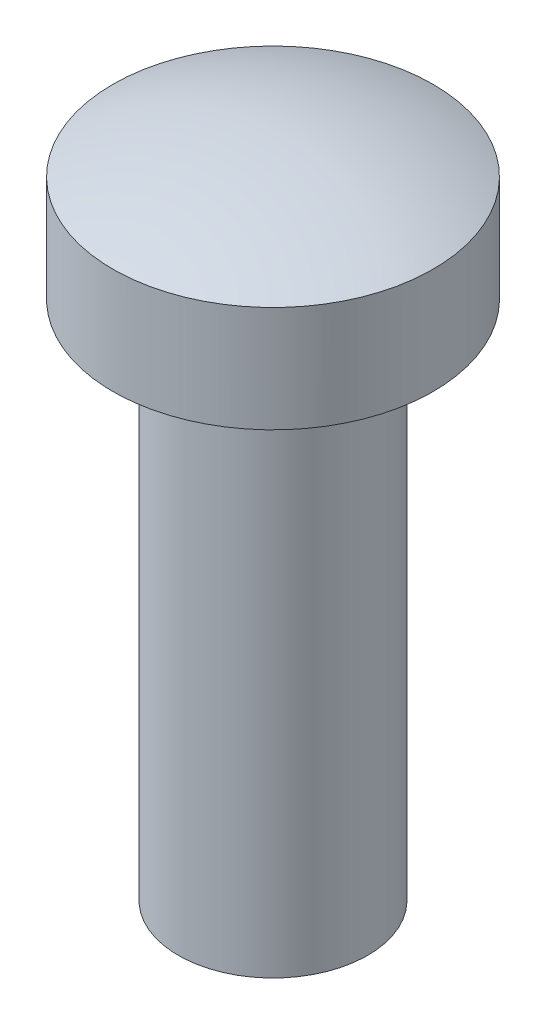
ISO-10303-21;
HEADER;
FILE_DESCRIPTION(('STEP AP214'),'2;1');
FILE_NAME('part.step','',(''),(''),'','','');
FILE_SCHEMA(('AUTOMOTIVE_DESIGN { 1 0 10303 214 1 1 1 1 }'));
ENDSEC;
DATA;
#1=APPLICATION_CONTEXT('core data for automotive mechanical design processes');
#2=APPLICATION_PROTOCOL_DEFINITION('international standard','automotive_design',2000,#1);
#3=PRODUCT_CONTEXT('',#1,'mechanical');
#4=PRODUCT('Part','Part','',(#3));
#5=PRODUCT_RELATED_PRODUCT_CATEGORY('part','',(#4));
#6=PRODUCT_DEFINITION_FORMATION('','',#4);
#7=PRODUCT_DEFINITION_CONTEXT('part definition',#1,'design');
#8=PRODUCT_DEFINITION('design','',#6,#7);
#9=PRODUCT_DEFINITION_SHAPE('','',#8);
#10=(LENGTH_UNIT() NAMED_UNIT(*) SI_UNIT(.MILLI.,.METRE.));
#11=(NAMED_UNIT(*) PLANE_ANGLE_UNIT() SI_UNIT($,.RADIAN.));
#12=(NAMED_UNIT(*) SI_UNIT($,.STERADIAN.) SOLID_ANGLE_UNIT());
#13=UNCERTAINTY_MEASURE_WITH_UNIT(LENGTH_MEASURE(1.E-05),#10,'distance_accuracy_value','');
#14=(GEOMETRIC_REPRESENTATION_CONTEXT(3) GLOBAL_UNCERTAINTY_ASSIGNED_CONTEXT((#13)) GLOBAL_UNIT_ASSIGNED_CONTEXT((#10,
#11,#12)) REPRESENTATION_CONTEXT('',''));
#15=CARTESIAN_POINT('',(0.,0.,0.));
#16=DIRECTION('',(0.,0.,1.));
#17=DIRECTION('',(1.,0.,0.));
#18=AXIS2_PLACEMENT_3D('',#15,#16,#17);
#19=CARTESIAN_POINT('',(-0.5,0.,0.));
#20=DIRECTION('',(0.,1.,0.));
#21=DIRECTION('',(0.,0.,1.));
#22=AXIS2_PLACEMENT_3D('',#19,#20,#21);
#23=PLANE('',#22);
#24=CARTESIAN_POINT('',(0.,0.,0.));
#25=DIRECTION('',(0.,-1.,0.));
#26=DIRECTION('',(0.,0.,-1.));
#27=AXIS2_PLACEMENT_3D('',#24,#25,#26);
#28=CIRCLE('',#27,0.5);
#29=CARTESIAN_POINT('',(0.,0.,-0.5));
#30=VERTEX_POINT('',#29);
#31=EDGE_CURVE('E48',#30,#30,#28,.T.);
#32=ORIENTED_EDGE('',*,*,#31,.T.);
#33=EDGE_LOOP('',(#32));
#34=FACE_BOUND('',#33,.T.);
#35=ADVANCED_FACE('F34',(#34),#23,.F.);
#36=CARTESIAN_POINT('',(0.,1.40205997847441,0.));
#37=DIRECTION('',(0.,-1.,0.));
#38=DIRECTION('',(-1.,0.,0.));
#39=AXIS2_PLACEMENT_3D('',#36,#37,#38);
#40=SPHERICAL_SURFACE('',#39,2.08617938322771);
#41=CARTESIAN_POINT('',(0.,3.30932024927531,0.));
#42=DIRECTION('',(0.,-1.,0.));
#43=DIRECTION('',(0.,0.,-1.));
#44=AXIS2_PLACEMENT_3D('',#41,#42,#43);
#45=CIRCLE('',#44,0.8452826027009);
#46=CARTESIAN_POINT('',(0.,3.30932024927531,-0.8452826027009));
#47=VERTEX_POINT('',#46);
#48=EDGE_CURVE('E10',#47,#47,#45,.T.);
#49=ORIENTED_EDGE('',*,*,#48,.F.);
#50=EDGE_LOOP('',(#49));
#51=FACE_BOUND('',#50,.T.);
#52=ADVANCED_FACE('F68',(#51),#40,.T.);
#53=CARTESIAN_POINT('',(0.,0.,0.));
#54=DIRECTION('',(0.,-1.,0.));
#55=DIRECTION('',(0.,0.,-1.));
#56=AXIS2_PLACEMENT_3D('',#53,#54,#55);
#57=CYLINDRICAL_SURFACE('',#56,0.8452826027009);
#58=CARTESIAN_POINT('',(0.,2.75,0.));
#59=DIRECTION('',(0.,-1.,0.));
#60=DIRECTION('',(0.,0.,-1.));
#61=AXIS2_PLACEMENT_3D('',#58,#59,#60);
#62=CIRCLE('',#61,0.8452826027009);
#63=CARTESIAN_POINT('',(0.,2.75,-0.8452826027009));
#64=VERTEX_POINT('',#63);
#65=EDGE_CURVE('E40',#64,#64,#62,.T.);
#66=ORIENTED_EDGE('',*,*,#65,.F.);
#67=EDGE_LOOP('',(#66));
#68=FACE_BOUND('',#67,.T.);
#69=ORIENTED_EDGE('',*,*,#48,.T.);
#70=EDGE_LOOP('',(#69));
#71=FACE_BOUND('',#70,.T.);
#72=ADVANCED_FACE('F63',(#68,#71),#57,.T.);
#73=CARTESIAN_POINT('',(-0.8452826027009,2.75,0.));
#74=DIRECTION('',(0.,1.,0.));
#75=DIRECTION('',(0.,0.,1.));
#76=AXIS2_PLACEMENT_3D('',#73,#74,#75);
#77=PLANE('',#76);
#78=CARTESIAN_POINT('',(0.,2.75,0.));
#79=DIRECTION('',(0.,-1.,0.));
#80=DIRECTION('',(0.,0.,-1.));
#81=AXIS2_PLACEMENT_3D('',#78,#79,#80);
#82=CIRCLE('',#81,0.5);
#83=CARTESIAN_POINT('',(0.,2.75,-0.5));
#84=VERTEX_POINT('',#83);
#85=EDGE_CURVE('E44',#84,#84,#82,.T.);
#86=ORIENTED_EDGE('',*,*,#85,.F.);
#87=EDGE_LOOP('',(#86));
#88=FACE_BOUND('',#87,.T.);
#89=ORIENTED_EDGE('',*,*,#65,.T.);
#90=EDGE_LOOP('',(#89));
#91=FACE_BOUND('',#90,.T.);
#92=ADVANCED_FACE('F58',(#88,#91),#77,.F.);
#93=CARTESIAN_POINT('',(0.,0.,0.));
#94=DIRECTION('',(0.,-1.,0.));
#95=DIRECTION('',(0.,0.,-1.));
#96=AXIS2_PLACEMENT_3D('',#93,#94,#95);
#97=CYLINDRICAL_SURFACE('',#96,0.5);
#98=ORIENTED_EDGE('',*,*,#31,.F.);
#99=EDGE_LOOP('',(#98));
#100=FACE_BOUND('',#99,.T.);
#101=ORIENTED_EDGE('',*,*,#85,.T.);
#102=EDGE_LOOP('',(#101));
#103=FACE_BOUND('',#102,.T.);
#104=ADVANCED_FACE('F55',(#100,#103),#97,.T.);
#105=CLOSED_SHELL('',(#35,#52,#72,#92,#104));
#106=MANIFOLD_SOLID_BREP('B2',#105);
#107=ADVANCED_BREP_SHAPE_REPRESENTATION('',(#18,#106),#14);
#108=SHAPE_DEFINITION_REPRESENTATION(#9,#107);
ENDSEC;
END-ISO-10303-21;
